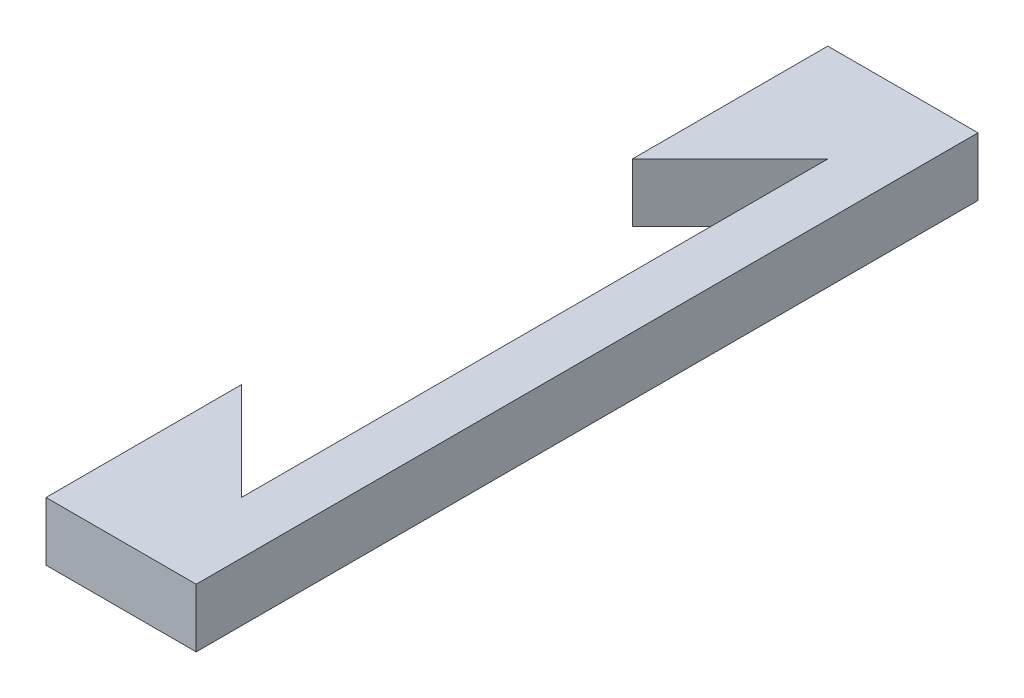
ISO-10303-21;
HEADER;
FILE_DESCRIPTION(('STEP AP214'),'2;1');
FILE_NAME('part.step','',(''),(''),'','','');
FILE_SCHEMA(('AUTOMOTIVE_DESIGN { 1 0 10303 214 1 1 1 1 }'));
ENDSEC;
DATA;
#1=APPLICATION_CONTEXT('core data for automotive mechanical design processes');
#2=APPLICATION_PROTOCOL_DEFINITION('international standard','automotive_design',2000,#1);
#3=PRODUCT_CONTEXT('',#1,'mechanical');
#4=PRODUCT('Part','Part','',(#3));
#5=PRODUCT_RELATED_PRODUCT_CATEGORY('part','',(#4));
#6=PRODUCT_DEFINITION_FORMATION('','',#4);
#7=PRODUCT_DEFINITION_CONTEXT('part definition',#1,'design');
#8=PRODUCT_DEFINITION('design','',#6,#7);
#9=PRODUCT_DEFINITION_SHAPE('','',#8);
#10=(LENGTH_UNIT() NAMED_UNIT(*) SI_UNIT(.MILLI.,.METRE.));
#11=(NAMED_UNIT(*) PLANE_ANGLE_UNIT() SI_UNIT($,.RADIAN.));
#12=(NAMED_UNIT(*) SI_UNIT($,.STERADIAN.) SOLID_ANGLE_UNIT());
#13=UNCERTAINTY_MEASURE_WITH_UNIT(LENGTH_MEASURE(1.E-05),#10,'distance_accuracy_value','');
#14=(GEOMETRIC_REPRESENTATION_CONTEXT(3) GLOBAL_UNCERTAINTY_ASSIGNED_CONTEXT((#13)) GLOBAL_UNIT_ASSIGNED_CONTEXT((#10,
#11,#12)) REPRESENTATION_CONTEXT('',''));
#15=CARTESIAN_POINT('',(0.,0.,0.));
#16=DIRECTION('',(0.,0.,1.));
#17=DIRECTION('',(1.,0.,0.));
#18=AXIS2_PLACEMENT_3D('',#15,#16,#17);
#19=CARTESIAN_POINT('',(0.,3.,0.));
#20=DIRECTION('',(0.,-1.,0.));
#21=DIRECTION('',(0.,0.,-1.));
#22=AXIS2_PLACEMENT_3D('',#19,#20,#21);
#23=PLANE('',#22);
#24=DIRECTION('',(0.,0.,1.));
#25=VECTOR('',#24,1.);
#26=CARTESIAN_POINT('',(-59.8154660730982,3.,0.));
#27=LINE('',#26,#25);
#28=CARTESIAN_POINT('',(-59.8154660730982,3.,-20.));
#29=VERTEX_POINT('',#28);
#30=CARTESIAN_POINT('',(-59.8154660730982,3.,20.));
#31=VERTEX_POINT('',#30);
#32=EDGE_CURVE('E55',#29,#31,#27,.T.);
#33=ORIENTED_EDGE('',*,*,#32,.F.);
#34=DIRECTION('',(-1.,0.,0.));
#35=VECTOR('',#34,1.);
#36=CARTESIAN_POINT('',(-67.5,3.,-20.));
#37=LINE('',#36,#35);
#38=CARTESIAN_POINT('',(-67.5,3.,-20.));
#39=VERTEX_POINT('',#38);
#40=EDGE_CURVE('E98',#29,#39,#37,.T.);
#41=ORIENTED_EDGE('',*,*,#40,.T.);
#42=DIRECTION('',(0.,0.,1.));
#43=VECTOR('',#42,1.);
#44=CARTESIAN_POINT('',(-67.5,3.,-10.0000000000001));
#45=LINE('',#44,#43);
#46=CARTESIAN_POINT('',(-67.5,3.,-10.0000000000001));
#47=VERTEX_POINT('',#46);
#48=EDGE_CURVE('E162',#39,#47,#45,.T.);
#49=ORIENTED_EDGE('',*,*,#48,.T.);
#50=DIRECTION('',(0.707106781186548,0.,-0.707106781186547));
#51=VECTOR('',#50,1.);
#52=CARTESIAN_POINT('',(-67.5,3.,-10.0000000000001));
#53=LINE('',#52,#51);
#54=CARTESIAN_POINT('',(-62.5,3.,-15.));
#55=VERTEX_POINT('',#54);
#56=EDGE_CURVE('E114',#47,#55,#53,.T.);
#57=ORIENTED_EDGE('',*,*,#56,.T.);
#58=DIRECTION('',(0.,0.,1.));
#59=VECTOR('',#58,1.);
#60=CARTESIAN_POINT('',(-62.5,3.,-15.));
#61=LINE('',#60,#59);
#62=CARTESIAN_POINT('',(-62.5,3.,15.));
#63=VERTEX_POINT('',#62);
#64=EDGE_CURVE('E108',#55,#63,#61,.T.);
#65=ORIENTED_EDGE('',*,*,#64,.T.);
#66=DIRECTION('',(-0.707106781186538,0.,-0.707106781186556));
#67=VECTOR('',#66,1.);
#68=CARTESIAN_POINT('',(-62.5,3.,15.));
#69=LINE('',#68,#67);
#70=CARTESIAN_POINT('',(-67.5,3.,9.99999999999992));
#71=VERTEX_POINT('',#70);
#72=EDGE_CURVE('E111',#63,#71,#69,.T.);
#73=ORIENTED_EDGE('',*,*,#72,.T.);
#74=DIRECTION('',(0.,0.,1.));
#75=VECTOR('',#74,1.);
#76=CARTESIAN_POINT('',(-67.5,3.,20.));
#77=LINE('',#76,#75);
#78=CARTESIAN_POINT('',(-67.5,3.,20.));
#79=VERTEX_POINT('',#78);
#80=EDGE_CURVE('E64',#71,#79,#77,.T.);
#81=ORIENTED_EDGE('',*,*,#80,.T.);
#82=DIRECTION('',(1.,0.,0.));
#83=VECTOR('',#82,1.);
#84=CARTESIAN_POINT('',(-67.5,3.,20.));
#85=LINE('',#84,#83);
#86=EDGE_CURVE('E131',#79,#31,#85,.T.);
#87=ORIENTED_EDGE('',*,*,#86,.T.);
#88=EDGE_LOOP('',(#33,#41,#49,#57,#65,#73,#81,#87));
#89=FACE_BOUND('',#88,.T.);
#90=ADVANCED_FACE('F41',(#89),#23,.F.);
#91=CARTESIAN_POINT('',(0.,0.,0.));
#92=DIRECTION('',(0.,-1.,0.));
#93=DIRECTION('',(0.,0.,-1.));
#94=AXIS2_PLACEMENT_3D('',#91,#92,#93);
#95=PLANE('',#94);
#96=DIRECTION('',(-1.,0.,0.));
#97=VECTOR('',#96,1.);
#98=CARTESIAN_POINT('',(-67.5,0.,-20.));
#99=LINE('',#98,#97);
#100=CARTESIAN_POINT('',(-59.8154660730982,0.,-20.));
#101=VERTEX_POINT('',#100);
#102=CARTESIAN_POINT('',(-67.5,0.,-20.));
#103=VERTEX_POINT('',#102);
#104=EDGE_CURVE('E137',#101,#103,#99,.T.);
#105=ORIENTED_EDGE('',*,*,#104,.F.);
#106=DIRECTION('',(0.,0.,1.));
#107=VECTOR('',#106,1.);
#108=CARTESIAN_POINT('',(-59.8154660730982,0.,0.));
#109=LINE('',#108,#107);
#110=CARTESIAN_POINT('',(-59.8154660730982,0.,20.));
#111=VERTEX_POINT('',#110);
#112=EDGE_CURVE('E177',#101,#111,#109,.T.);
#113=ORIENTED_EDGE('',*,*,#112,.T.);
#114=DIRECTION('',(1.,0.,0.));
#115=VECTOR('',#114,1.);
#116=CARTESIAN_POINT('',(-67.5,0.,20.));
#117=LINE('',#116,#115);
#118=CARTESIAN_POINT('',(-67.5,0.,20.));
#119=VERTEX_POINT('',#118);
#120=EDGE_CURVE('E148',#119,#111,#117,.T.);
#121=ORIENTED_EDGE('',*,*,#120,.F.);
#122=DIRECTION('',(0.,0.,1.));
#123=VECTOR('',#122,1.);
#124=CARTESIAN_POINT('',(-67.5,0.,20.));
#125=LINE('',#124,#123);
#126=CARTESIAN_POINT('',(-67.5,0.,9.99999999999992));
#127=VERTEX_POINT('',#126);
#128=EDGE_CURVE('E91',#127,#119,#125,.T.);
#129=ORIENTED_EDGE('',*,*,#128,.F.);
#130=DIRECTION('',(-0.707106781186538,0.,-0.707106781186556));
#131=VECTOR('',#130,1.);
#132=CARTESIAN_POINT('',(-62.5,0.,15.));
#133=LINE('',#132,#131);
#134=CARTESIAN_POINT('',(-62.5,0.,15.));
#135=VERTEX_POINT('',#134);
#136=EDGE_CURVE('E145',#135,#127,#133,.T.);
#137=ORIENTED_EDGE('',*,*,#136,.F.);
#138=DIRECTION('',(0.,0.,1.));
#139=VECTOR('',#138,1.);
#140=CARTESIAN_POINT('',(-62.5,0.,-15.));
#141=LINE('',#140,#139);
#142=CARTESIAN_POINT('',(-62.5,0.,-15.));
#143=VERTEX_POINT('',#142);
#144=EDGE_CURVE('E123',#143,#135,#141,.T.);
#145=ORIENTED_EDGE('',*,*,#144,.F.);
#146=DIRECTION('',(0.707106781186548,0.,-0.707106781186547));
#147=VECTOR('',#146,1.);
#148=CARTESIAN_POINT('',(-67.5,0.,-10.0000000000001));
#149=LINE('',#148,#147);
#150=CARTESIAN_POINT('',(-67.5,0.,-10.0000000000001));
#151=VERTEX_POINT('',#150);
#152=EDGE_CURVE('E142',#151,#143,#149,.T.);
#153=ORIENTED_EDGE('',*,*,#152,.F.);
#154=DIRECTION('',(0.,0.,1.));
#155=VECTOR('',#154,1.);
#156=CARTESIAN_POINT('',(-67.5,0.,-10.0000000000001));
#157=LINE('',#156,#155);
#158=EDGE_CURVE('E139',#103,#151,#157,.T.);
#159=ORIENTED_EDGE('',*,*,#158,.F.);
#160=EDGE_LOOP('',(#105,#113,#121,#129,#137,#145,#153,#159));
#161=FACE_BOUND('',#160,.T.);
#162=ADVANCED_FACE('F167',(#161),#95,.T.);
#163=CARTESIAN_POINT('',(-67.5,3.,-20.));
#164=DIRECTION('',(0.,0.,1.));
#165=DIRECTION('',(1.,0.,0.));
#166=AXIS2_PLACEMENT_3D('',#163,#164,#165);
#167=PLANE('',#166);
#168=DIRECTION('',(0.,1.,0.));
#169=VECTOR('',#168,1.);
#170=CARTESIAN_POINT('',(-59.8154660730982,3.,-20.));
#171=LINE('',#170,#169);
#172=EDGE_CURVE('E140',#101,#29,#171,.T.);
#173=ORIENTED_EDGE('',*,*,#172,.F.);
#174=ORIENTED_EDGE('',*,*,#104,.T.);
#175=DIRECTION('',(0.,-1.,0.));
#176=VECTOR('',#175,1.);
#177=CARTESIAN_POINT('',(-67.5,3.,-20.));
#178=LINE('',#177,#176);
#179=EDGE_CURVE('E49',#39,#103,#178,.T.);
#180=ORIENTED_EDGE('',*,*,#179,.F.);
#181=ORIENTED_EDGE('',*,*,#40,.F.);
#182=EDGE_LOOP('',(#173,#174,#180,#181));
#183=FACE_BOUND('',#182,.T.);
#184=ADVANCED_FACE('F43',(#183),#167,.F.);
#185=CARTESIAN_POINT('',(-67.5,3.,20.));
#186=DIRECTION('',(0.,0.,-1.));
#187=DIRECTION('',(-1.,0.,0.));
#188=AXIS2_PLACEMENT_3D('',#185,#186,#187);
#189=PLANE('',#188);
#190=DIRECTION('',(0.,-1.,0.));
#191=VECTOR('',#190,1.);
#192=CARTESIAN_POINT('',(-59.8154660730982,3.,20.));
#193=LINE('',#192,#191);
#194=EDGE_CURVE('E11',#31,#111,#193,.T.);
#195=ORIENTED_EDGE('',*,*,#194,.F.);
#196=ORIENTED_EDGE('',*,*,#86,.F.);
#197=DIRECTION('',(0.,-1.,0.));
#198=VECTOR('',#197,1.);
#199=CARTESIAN_POINT('',(-67.5,3.,20.));
#200=LINE('',#199,#198);
#201=EDGE_CURVE('E136',#79,#119,#200,.T.);
#202=ORIENTED_EDGE('',*,*,#201,.T.);
#203=ORIENTED_EDGE('',*,*,#120,.T.);
#204=EDGE_LOOP('',(#195,#196,#202,#203));
#205=FACE_BOUND('',#204,.T.);
#206=ADVANCED_FACE('F184',(#205),#189,.F.);
#207=CARTESIAN_POINT('',(-67.5,3.,-10.0000000000001));
#208=DIRECTION('',(1.,0.,0.));
#209=DIRECTION('',(0.,0.,-1.));
#210=AXIS2_PLACEMENT_3D('',#207,#208,#209);
#211=PLANE('',#210);
#212=ORIENTED_EDGE('',*,*,#158,.T.);
#213=DIRECTION('',(0.,-1.,0.));
#214=VECTOR('',#213,1.);
#215=CARTESIAN_POINT('',(-67.5,3.,-10.0000000000001));
#216=LINE('',#215,#214);
#217=EDGE_CURVE('E154',#47,#151,#216,.T.);
#218=ORIENTED_EDGE('',*,*,#217,.F.);
#219=ORIENTED_EDGE('',*,*,#48,.F.);
#220=ORIENTED_EDGE('',*,*,#179,.T.);
#221=EDGE_LOOP('',(#212,#218,#219,#220));
#222=FACE_BOUND('',#221,.T.);
#223=ADVANCED_FACE('F160',(#222),#211,.F.);
#224=CARTESIAN_POINT('',(-67.5,3.,-10.0000000000001));
#225=DIRECTION('',(-0.707106781186547,0.,-0.707106781186548));
#226=DIRECTION('',(-0.707106781186548,0.,0.707106781186547));
#227=AXIS2_PLACEMENT_3D('',#224,#225,#226);
#228=PLANE('',#227);
#229=ORIENTED_EDGE('',*,*,#152,.T.);
#230=DIRECTION('',(0.,-1.,0.));
#231=VECTOR('',#230,1.);
#232=CARTESIAN_POINT('',(-62.5,3.,-15.));
#233=LINE('',#232,#231);
#234=EDGE_CURVE('E126',#55,#143,#233,.T.);
#235=ORIENTED_EDGE('',*,*,#234,.F.);
#236=ORIENTED_EDGE('',*,*,#56,.F.);
#237=ORIENTED_EDGE('',*,*,#217,.T.);
#238=EDGE_LOOP('',(#229,#235,#236,#237));
#239=FACE_BOUND('',#238,.T.);
#240=ADVANCED_FACE('F171',(#239),#228,.F.);
#241=CARTESIAN_POINT('',(-62.5,3.,-15.));
#242=DIRECTION('',(1.,0.,0.));
#243=DIRECTION('',(0.,0.,-1.));
#244=AXIS2_PLACEMENT_3D('',#241,#242,#243);
#245=PLANE('',#244);
#246=ORIENTED_EDGE('',*,*,#144,.T.);
#247=DIRECTION('',(0.,-1.,0.));
#248=VECTOR('',#247,1.);
#249=CARTESIAN_POINT('',(-62.5,3.,15.));
#250=LINE('',#249,#248);
#251=EDGE_CURVE('E120',#63,#135,#250,.T.);
#252=ORIENTED_EDGE('',*,*,#251,.F.);
#253=ORIENTED_EDGE('',*,*,#64,.F.);
#254=ORIENTED_EDGE('',*,*,#234,.T.);
#255=EDGE_LOOP('',(#246,#252,#253,#254));
#256=FACE_BOUND('',#255,.T.);
#257=ADVANCED_FACE('F121',(#256),#245,.F.);
#258=CARTESIAN_POINT('',(-62.5,3.,15.));
#259=DIRECTION('',(-0.707106781186557,0.,0.707106781186538));
#260=DIRECTION('',(0.707106781186538,0.,0.707106781186557));
#261=AXIS2_PLACEMENT_3D('',#258,#259,#260);
#262=PLANE('',#261);
#263=ORIENTED_EDGE('',*,*,#136,.T.);
#264=DIRECTION('',(0.,-1.,0.));
#265=VECTOR('',#264,1.);
#266=CARTESIAN_POINT('',(-67.5,3.,9.99999999999992));
#267=LINE('',#266,#265);
#268=EDGE_CURVE('E127',#71,#127,#267,.T.);
#269=ORIENTED_EDGE('',*,*,#268,.F.);
#270=ORIENTED_EDGE('',*,*,#72,.F.);
#271=ORIENTED_EDGE('',*,*,#251,.T.);
#272=EDGE_LOOP('',(#263,#269,#270,#271));
#273=FACE_BOUND('',#272,.T.);
#274=ADVANCED_FACE('F129',(#273),#262,.F.);
#275=CARTESIAN_POINT('',(-67.5,3.,20.));
#276=DIRECTION('',(1.,0.,0.));
#277=DIRECTION('',(0.,0.,-1.));
#278=AXIS2_PLACEMENT_3D('',#275,#276,#277);
#279=PLANE('',#278);
#280=ORIENTED_EDGE('',*,*,#128,.T.);
#281=ORIENTED_EDGE('',*,*,#201,.F.);
#282=ORIENTED_EDGE('',*,*,#80,.F.);
#283=ORIENTED_EDGE('',*,*,#268,.T.);
#284=EDGE_LOOP('',(#280,#281,#282,#283));
#285=FACE_BOUND('',#284,.T.);
#286=ADVANCED_FACE('F186',(#285),#279,.F.);
#287=CARTESIAN_POINT('',(-59.8154660730982,13.,-36.7376239944149));
#288=DIRECTION('',(1.,0.,0.));
#289=DIRECTION('',(0.,0.,-1.));
#290=AXIS2_PLACEMENT_3D('',#287,#288,#289);
#291=PLANE('',#290);
#292=ORIENTED_EDGE('',*,*,#172,.T.);
#293=ORIENTED_EDGE('',*,*,#32,.T.);
#294=ORIENTED_EDGE('',*,*,#194,.T.);
#295=ORIENTED_EDGE('',*,*,#112,.F.);
#296=EDGE_LOOP('',(#292,#293,#294,#295));
#297=FACE_BOUND('',#296,.T.);
#298=ADVANCED_FACE('F188',(#297),#291,.T.);
#299=CLOSED_SHELL('',(#90,#162,#184,#206,#223,#240,#257,#274,#286,#298));
#300=MANIFOLD_SOLID_BREP('B2',#299);
#301=ADVANCED_BREP_SHAPE_REPRESENTATION('',(#18,#300),#14);
#302=SHAPE_DEFINITION_REPRESENTATION(#9,#301);
ENDSEC;
END-ISO-10303-21;
